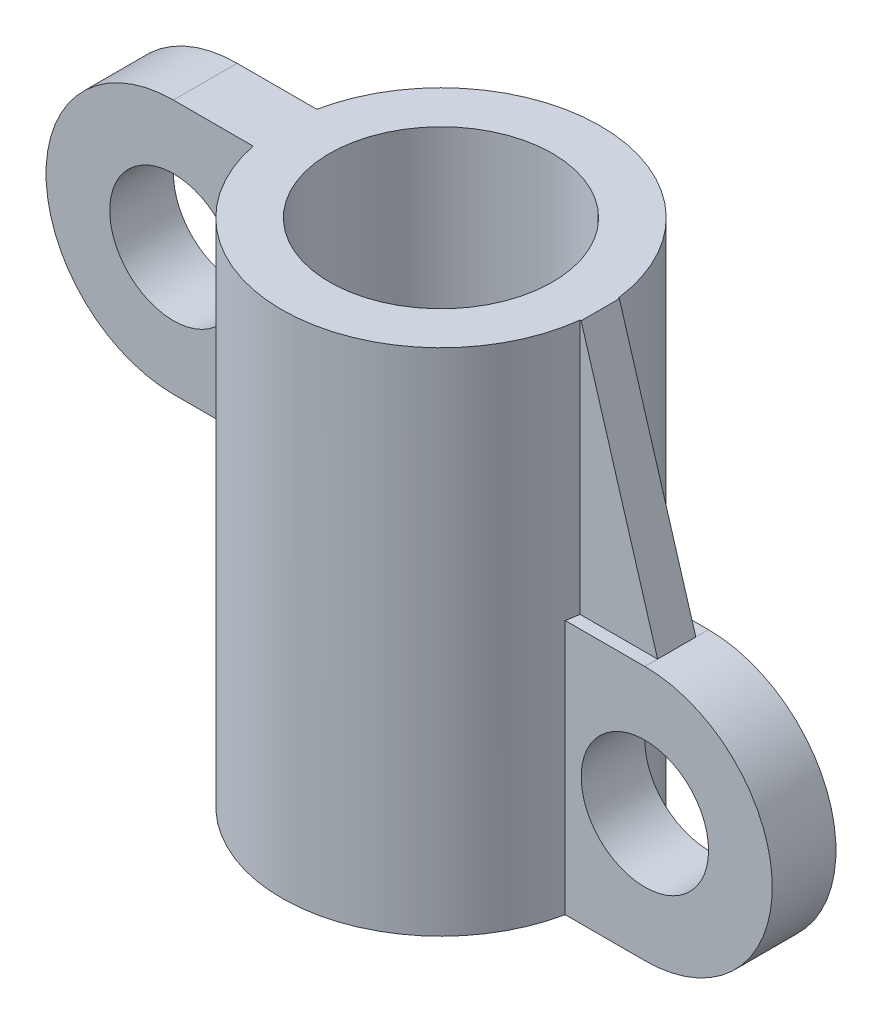
ISO-10303-21;
HEADER;
FILE_DESCRIPTION(('STEP AP214'),'2;1');
FILE_NAME('part.step','',(''),(''),'','','');
FILE_SCHEMA(('AUTOMOTIVE_DESIGN { 1 0 10303 214 1 1 1 1 }'));
ENDSEC;
DATA;
#1=APPLICATION_CONTEXT('core data for automotive mechanical design processes');
#2=APPLICATION_PROTOCOL_DEFINITION('international standard','automotive_design',2000,#1);
#3=PRODUCT_CONTEXT('',#1,'mechanical');
#4=PRODUCT('Part','Part','',(#3));
#5=PRODUCT_RELATED_PRODUCT_CATEGORY('part','',(#4));
#6=PRODUCT_DEFINITION_FORMATION('','',#4);
#7=PRODUCT_DEFINITION_CONTEXT('part definition',#1,'design');
#8=PRODUCT_DEFINITION('design','',#6,#7);
#9=PRODUCT_DEFINITION_SHAPE('','',#8);
#10=(LENGTH_UNIT() NAMED_UNIT(*) SI_UNIT(.MILLI.,.METRE.));
#11=(NAMED_UNIT(*) PLANE_ANGLE_UNIT() SI_UNIT($,.RADIAN.));
#12=(NAMED_UNIT(*) SI_UNIT($,.STERADIAN.) SOLID_ANGLE_UNIT());
#13=UNCERTAINTY_MEASURE_WITH_UNIT(LENGTH_MEASURE(1.E-05),#10,'distance_accuracy_value','');
#14=(GEOMETRIC_REPRESENTATION_CONTEXT(3) GLOBAL_UNCERTAINTY_ASSIGNED_CONTEXT((#13)) GLOBAL_UNIT_ASSIGNED_CONTEXT((#10,
#11,#12)) REPRESENTATION_CONTEXT('',''));
#15=CARTESIAN_POINT('',(0.,0.,0.));
#16=DIRECTION('',(0.,0.,1.));
#17=DIRECTION('',(1.,0.,0.));
#18=AXIS2_PLACEMENT_3D('',#15,#16,#17);
#19=CARTESIAN_POINT('',(37.,40.,-5.));
#20=DIRECTION('',(0.,1.,0.));
#21=DIRECTION('',(-1.,0.,0.));
#22=AXIS2_PLACEMENT_3D('',#19,#20,#21);
#23=PLANE('',#22);
#24=DIRECTION('',(0.,0.,1.));
#25=VECTOR('',#24,1.);
#26=CARTESIAN_POINT('',(37.,40.,-5.));
#27=LINE('',#26,#25);
#28=CARTESIAN_POINT('',(37.,40.,3.));
#29=VERTEX_POINT('',#28);
#30=CARTESIAN_POINT('',(37.,40.,5.));
#31=VERTEX_POINT('',#30);
#32=EDGE_CURVE('E222',#29,#31,#27,.T.);
#33=ORIENTED_EDGE('',*,*,#32,.F.);
#34=DIRECTION('',(1.,0.,0.));
#35=VECTOR('',#34,1.);
#36=CARTESIAN_POINT('',(37.,40.,3.));
#37=LINE('',#36,#35);
#38=CARTESIAN_POINT('',(24.8193472919817,40.,3.));
#39=VERTEX_POINT('',#38);
#40=EDGE_CURVE('E151',#39,#29,#37,.T.);
#41=ORIENTED_EDGE('',*,*,#40,.F.);
#42=CARTESIAN_POINT('',(0.,40.,0.));
#43=DIRECTION('',(0.,1.,0.));
#44=DIRECTION('',(-1.,0.,0.));
#45=AXIS2_PLACEMENT_3D('',#42,#43,#44);
#46=CIRCLE('',#45,25.);
#47=CARTESIAN_POINT('',(24.4948974278318,40.,5.));
#48=VERTEX_POINT('',#47);
#49=EDGE_CURVE('E11',#48,#39,#46,.T.);
#50=ORIENTED_EDGE('',*,*,#49,.F.);
#51=DIRECTION('',(-1.,0.,0.));
#52=VECTOR('',#51,1.);
#53=CARTESIAN_POINT('',(37.,40.,5.));
#54=LINE('',#53,#52);
#55=EDGE_CURVE('E69',#31,#48,#54,.T.);
#56=ORIENTED_EDGE('',*,*,#55,.F.);
#57=EDGE_LOOP('',(#33,#41,#50,#56));
#58=FACE_BOUND('',#57,.T.);
#59=ADVANCED_FACE('F45',(#58),#23,.T.);
#60=CARTESIAN_POINT('',(0.,80.,0.));
#61=DIRECTION('',(0.,-1.,0.));
#62=DIRECTION('',(0.,0.,-1.));
#63=AXIS2_PLACEMENT_3D('',#60,#61,#62);
#64=CYLINDRICAL_SURFACE('',#63,25.);
#65=CARTESIAN_POINT('',(0.,80.,0.));
#66=DIRECTION('',(0.,1.,0.));
#67=DIRECTION('',(0.,0.,1.));
#68=AXIS2_PLACEMENT_3D('',#65,#66,#67);
#69=CIRCLE('',#68,25.);
#70=CARTESIAN_POINT('',(24.8193472919817,80.,-3.));
#71=VERTEX_POINT('',#70);
#72=CARTESIAN_POINT('',(-24.4948974278318,80.,-5.));
#73=VERTEX_POINT('',#72);
#74=EDGE_CURVE('E280',#71,#73,#69,.T.);
#75=ORIENTED_EDGE('',*,*,#74,.F.);
#76=DIRECTION('',(0.,-1.,0.));
#77=VECTOR('',#76,1.);
#78=CARTESIAN_POINT('',(24.8193472919817,80.,-3.));
#79=LINE('',#78,#77);
#80=CARTESIAN_POINT('',(24.8193472919817,40.,-3.));
#81=VERTEX_POINT('',#80);
#82=EDGE_CURVE('E185',#71,#81,#79,.T.);
#83=ORIENTED_EDGE('',*,*,#82,.T.);
#84=CARTESIAN_POINT('',(24.4948974278318,40.,-5.));
#85=VERTEX_POINT('',#84);
#86=EDGE_CURVE('E54',#81,#85,#46,.T.);
#87=ORIENTED_EDGE('',*,*,#86,.T.);
#88=DIRECTION('',(0.,-1.,0.));
#89=VECTOR('',#88,1.);
#90=CARTESIAN_POINT('',(24.4948974278318,80.,-5.));
#91=LINE('',#90,#89);
#92=CARTESIAN_POINT('',(24.4948974278318,0.,-5.));
#93=VERTEX_POINT('',#92);
#94=EDGE_CURVE('E229',#93,#85,#91,.F.);
#95=ORIENTED_EDGE('',*,*,#94,.F.);
#96=CARTESIAN_POINT('',(0.,0.,0.));
#97=DIRECTION('',(0.,1.,0.));
#98=DIRECTION('',(0.,0.,1.));
#99=AXIS2_PLACEMENT_3D('',#96,#97,#98);
#100=CIRCLE('',#99,25.);
#101=CARTESIAN_POINT('',(24.4948974278318,0.,5.));
#102=VERTEX_POINT('',#101);
#103=EDGE_CURVE('E276',#93,#102,#100,.T.);
#104=ORIENTED_EDGE('',*,*,#103,.T.);
#105=DIRECTION('',(0.,-1.,0.));
#106=VECTOR('',#105,1.);
#107=CARTESIAN_POINT('',(24.4948974278318,80.,5.));
#108=LINE('',#107,#106);
#109=EDGE_CURVE('E221',#102,#48,#108,.F.);
#110=ORIENTED_EDGE('',*,*,#109,.T.);
#111=ORIENTED_EDGE('',*,*,#49,.T.);
#112=DIRECTION('',(0.,-1.,0.));
#113=VECTOR('',#112,1.);
#114=CARTESIAN_POINT('',(24.8193472919817,80.,3.));
#115=LINE('',#114,#113);
#116=CARTESIAN_POINT('',(24.8193472919817,80.,3.));
#117=VERTEX_POINT('',#116);
#118=EDGE_CURVE('E143',#117,#39,#115,.T.);
#119=ORIENTED_EDGE('',*,*,#118,.F.);
#120=CARTESIAN_POINT('',(-24.4948974278318,80.,5.));
#121=VERTEX_POINT('',#120);
#122=EDGE_CURVE('E160',#121,#117,#69,.T.);
#123=ORIENTED_EDGE('',*,*,#122,.F.);
#124=DIRECTION('',(0.,-1.,0.));
#125=VECTOR('',#124,1.);
#126=CARTESIAN_POINT('',(-24.4948974278318,80.,5.));
#127=LINE('',#126,#125);
#128=CARTESIAN_POINT('',(-24.4948974278318,40.,5.));
#129=VERTEX_POINT('',#128);
#130=EDGE_CURVE('E266',#121,#129,#127,.T.);
#131=ORIENTED_EDGE('',*,*,#130,.T.);
#132=CARTESIAN_POINT('',(0.,40.,0.));
#133=DIRECTION('',(0.,-1.,0.));
#134=DIRECTION('',(0.,0.,-1.));
#135=AXIS2_PLACEMENT_3D('',#132,#133,#134);
#136=CIRCLE('',#135,25.);
#137=CARTESIAN_POINT('',(-24.4948974278318,40.,-5.));
#138=VERTEX_POINT('',#137);
#139=EDGE_CURVE('E279',#129,#138,#136,.T.);
#140=ORIENTED_EDGE('',*,*,#139,.T.);
#141=DIRECTION('',(0.,-1.,0.));
#142=VECTOR('',#141,1.);
#143=CARTESIAN_POINT('',(-24.4948974278318,80.,-5.));
#144=LINE('',#143,#142);
#145=EDGE_CURVE('E273',#73,#138,#144,.T.);
#146=ORIENTED_EDGE('',*,*,#145,.F.);
#147=EDGE_LOOP('',(#75,#83,#87,#95,#104,#110,#111,#119,#123,#131,#140,#146));
#148=FACE_BOUND('',#147,.T.);
#149=ADVANCED_FACE('F47',(#148),#64,.T.);
#150=CARTESIAN_POINT('',(0.,80.,0.));
#151=DIRECTION('',(0.,1.,0.));
#152=DIRECTION('',(0.,0.,1.));
#153=AXIS2_PLACEMENT_3D('',#150,#151,#152);
#154=PLANE('',#153);
#155=CARTESIAN_POINT('',(0.,80.,0.));
#156=DIRECTION('',(0.,1.,0.));
#157=DIRECTION('',(0.,0.,1.));
#158=AXIS2_PLACEMENT_3D('',#155,#156,#157);
#159=CIRCLE('',#158,17.5);
#160=CARTESIAN_POINT('',(0.,80.,-17.5));
#161=VERTEX_POINT('',#160);
#162=EDGE_CURVE('E162',#161,#161,#159,.T.);
#163=ORIENTED_EDGE('',*,*,#162,.F.);
#164=EDGE_LOOP('',(#163));
#165=FACE_BOUND('',#164,.T.);
#166=ORIENTED_EDGE('',*,*,#122,.T.);
#167=DIRECTION('',(-1.,0.,0.));
#168=VECTOR('',#167,1.);
#169=CARTESIAN_POINT('',(25.,80.,3.));
#170=LINE('',#169,#168);
#171=CARTESIAN_POINT('',(25.,80.,3.));
#172=VERTEX_POINT('',#171);
#173=EDGE_CURVE('E148',#172,#117,#170,.T.);
#174=ORIENTED_EDGE('',*,*,#173,.F.);
#175=DIRECTION('',(0.,0.,1.));
#176=VECTOR('',#175,1.);
#177=CARTESIAN_POINT('',(25.,80.,-3.));
#178=LINE('',#177,#176);
#179=CARTESIAN_POINT('',(25.,80.,-3.));
#180=VERTEX_POINT('',#179);
#181=EDGE_CURVE('E134',#180,#172,#178,.T.);
#182=ORIENTED_EDGE('',*,*,#181,.F.);
#183=DIRECTION('',(-1.,0.,0.));
#184=VECTOR('',#183,1.);
#185=CARTESIAN_POINT('',(25.,80.,-3.));
#186=LINE('',#185,#184);
#187=EDGE_CURVE('E154',#180,#71,#186,.T.);
#188=ORIENTED_EDGE('',*,*,#187,.T.);
#189=ORIENTED_EDGE('',*,*,#74,.T.);
#190=DIRECTION('',(-1.,0.,0.));
#191=VECTOR('',#190,1.);
#192=CARTESIAN_POINT('',(0.,80.,-5.));
#193=LINE('',#192,#191);
#194=CARTESIAN_POINT('',(-37.,80.,-5.));
#195=VERTEX_POINT('',#194);
#196=EDGE_CURVE('E251',#73,#195,#193,.T.);
#197=ORIENTED_EDGE('',*,*,#196,.T.);
#198=DIRECTION('',(0.,0.,1.));
#199=VECTOR('',#198,1.);
#200=CARTESIAN_POINT('',(-37.,80.,-5.));
#201=LINE('',#200,#199);
#202=CARTESIAN_POINT('',(-37.,80.,5.));
#203=VERTEX_POINT('',#202);
#204=EDGE_CURVE('E262',#195,#203,#201,.T.);
#205=ORIENTED_EDGE('',*,*,#204,.T.);
#206=DIRECTION('',(-1.,0.,0.));
#207=VECTOR('',#206,1.);
#208=CARTESIAN_POINT('',(0.,80.,5.));
#209=LINE('',#208,#207);
#210=EDGE_CURVE('E237',#121,#203,#209,.T.);
#211=ORIENTED_EDGE('',*,*,#210,.F.);
#212=EDGE_LOOP('',(#166,#174,#182,#188,#189,#197,#205,#211));
#213=FACE_BOUND('',#212,.T.);
#214=ADVANCED_FACE('F157',(#165,#213),#154,.T.);
#215=CARTESIAN_POINT('',(0.,0.,0.));
#216=DIRECTION('',(0.,1.,0.));
#217=DIRECTION('',(0.,0.,1.));
#218=AXIS2_PLACEMENT_3D('',#215,#216,#217);
#219=PLANE('',#218);
#220=CARTESIAN_POINT('',(0.,0.,0.));
#221=DIRECTION('',(0.,1.,0.));
#222=DIRECTION('',(0.,0.,1.));
#223=AXIS2_PLACEMENT_3D('',#220,#221,#222);
#224=CIRCLE('',#223,17.5);
#225=CARTESIAN_POINT('',(0.,0.,-17.5));
#226=VERTEX_POINT('',#225);
#227=EDGE_CURVE('E168',#226,#226,#224,.T.);
#228=ORIENTED_EDGE('',*,*,#227,.T.);
#229=EDGE_LOOP('',(#228));
#230=FACE_BOUND('',#229,.T.);
#231=ORIENTED_EDGE('',*,*,#103,.F.);
#232=DIRECTION('',(1.,0.,0.));
#233=VECTOR('',#232,1.);
#234=CARTESIAN_POINT('',(0.,0.,-5.));
#235=LINE('',#234,#233);
#236=CARTESIAN_POINT('',(37.,0.,-5.));
#237=VERTEX_POINT('',#236);
#238=EDGE_CURVE('E205',#93,#237,#235,.T.);
#239=ORIENTED_EDGE('',*,*,#238,.T.);
#240=DIRECTION('',(0.,0.,1.));
#241=VECTOR('',#240,1.);
#242=CARTESIAN_POINT('',(37.,0.,-5.));
#243=LINE('',#242,#241);
#244=CARTESIAN_POINT('',(37.,0.,5.));
#245=VERTEX_POINT('',#244);
#246=EDGE_CURVE('E216',#237,#245,#243,.T.);
#247=ORIENTED_EDGE('',*,*,#246,.T.);
#248=DIRECTION('',(1.,0.,0.));
#249=VECTOR('',#248,1.);
#250=CARTESIAN_POINT('',(0.,0.,5.));
#251=LINE('',#250,#249);
#252=EDGE_CURVE('E193',#102,#245,#251,.T.);
#253=ORIENTED_EDGE('',*,*,#252,.F.);
#254=EDGE_LOOP('',(#231,#239,#247,#253));
#255=FACE_BOUND('',#254,.T.);
#256=ADVANCED_FACE('F305',(#230,#255),#219,.F.);
#257=CARTESIAN_POINT('',(-37.,60.,-5.));
#258=DIRECTION('',(0.,0.,1.));
#259=DIRECTION('',(1.,0.,0.));
#260=AXIS2_PLACEMENT_3D('',#257,#258,#259);
#261=PLANE('',#260);
#262=CARTESIAN_POINT('',(-37.,60.,-5.));
#263=DIRECTION('',(0.,0.,1.));
#264=DIRECTION('',(1.,0.,0.));
#265=AXIS2_PLACEMENT_3D('',#262,#263,#264);
#266=CIRCLE('',#265,10.);
#267=CARTESIAN_POINT('',(-27.,60.,-5.));
#268=VERTEX_POINT('',#267);
#269=EDGE_CURVE('E247',#268,#268,#266,.T.);
#270=ORIENTED_EDGE('',*,*,#269,.T.);
#271=EDGE_LOOP('',(#270));
#272=FACE_BOUND('',#271,.T.);
#273=ORIENTED_EDGE('',*,*,#196,.F.);
#274=ORIENTED_EDGE('',*,*,#145,.T.);
#275=DIRECTION('',(1.,0.,0.));
#276=VECTOR('',#275,1.);
#277=CARTESIAN_POINT('',(-37.,40.,-5.));
#278=LINE('',#277,#276);
#279=CARTESIAN_POINT('',(-37.,40.,-5.));
#280=VERTEX_POINT('',#279);
#281=EDGE_CURVE('E258',#280,#138,#278,.T.);
#282=ORIENTED_EDGE('',*,*,#281,.F.);
#283=CARTESIAN_POINT('',(-37.,60.,-5.));
#284=DIRECTION('',(0.,0.,1.));
#285=DIRECTION('',(1.,0.,0.));
#286=AXIS2_PLACEMENT_3D('',#283,#284,#285);
#287=CIRCLE('',#286,20.);
#288=EDGE_CURVE('E254',#195,#280,#287,.T.);
#289=ORIENTED_EDGE('',*,*,#288,.F.);
#290=EDGE_LOOP('',(#273,#274,#282,#289));
#291=FACE_BOUND('',#290,.T.);
#292=ADVANCED_FACE('F315',(#272,#291),#261,.F.);
#293=CARTESIAN_POINT('',(-37.,60.,5.));
#294=DIRECTION('',(0.,0.,1.));
#295=DIRECTION('',(1.,0.,0.));
#296=AXIS2_PLACEMENT_3D('',#293,#294,#295);
#297=PLANE('',#296);
#298=CARTESIAN_POINT('',(-37.,60.,5.));
#299=DIRECTION('',(0.,0.,1.));
#300=DIRECTION('',(1.,0.,0.));
#301=AXIS2_PLACEMENT_3D('',#298,#299,#300);
#302=CIRCLE('',#301,10.);
#303=CARTESIAN_POINT('',(-27.,60.,5.));
#304=VERTEX_POINT('',#303);
#305=EDGE_CURVE('E233',#304,#304,#302,.T.);
#306=ORIENTED_EDGE('',*,*,#305,.F.);
#307=EDGE_LOOP('',(#306));
#308=FACE_BOUND('',#307,.T.);
#309=ORIENTED_EDGE('',*,*,#130,.F.);
#310=ORIENTED_EDGE('',*,*,#210,.T.);
#311=CARTESIAN_POINT('',(-37.,60.,5.));
#312=DIRECTION('',(0.,0.,1.));
#313=DIRECTION('',(1.,0.,0.));
#314=AXIS2_PLACEMENT_3D('',#311,#312,#313);
#315=CIRCLE('',#314,20.);
#316=CARTESIAN_POINT('',(-37.,40.,5.));
#317=VERTEX_POINT('',#316);
#318=EDGE_CURVE('E240',#203,#317,#315,.T.);
#319=ORIENTED_EDGE('',*,*,#318,.T.);
#320=DIRECTION('',(1.,0.,0.));
#321=VECTOR('',#320,1.);
#322=CARTESIAN_POINT('',(-37.,40.,5.));
#323=LINE('',#322,#321);
#324=EDGE_CURVE('E244',#317,#129,#323,.T.);
#325=ORIENTED_EDGE('',*,*,#324,.T.);
#326=EDGE_LOOP('',(#309,#310,#319,#325));
#327=FACE_BOUND('',#326,.T.);
#328=ADVANCED_FACE('F325',(#308,#327),#297,.T.);
#329=CARTESIAN_POINT('',(-37.,40.,-5.));
#330=DIRECTION('',(0.,-1.,0.));
#331=DIRECTION('',(0.,0.,-1.));
#332=AXIS2_PLACEMENT_3D('',#329,#330,#331);
#333=PLANE('',#332);
#334=ORIENTED_EDGE('',*,*,#139,.F.);
#335=ORIENTED_EDGE('',*,*,#324,.F.);
#336=DIRECTION('',(0.,0.,1.));
#337=VECTOR('',#336,1.);
#338=CARTESIAN_POINT('',(-37.,40.,-5.));
#339=LINE('',#338,#337);
#340=EDGE_CURVE('E263',#280,#317,#339,.T.);
#341=ORIENTED_EDGE('',*,*,#340,.F.);
#342=ORIENTED_EDGE('',*,*,#281,.T.);
#343=EDGE_LOOP('',(#334,#335,#341,#342));
#344=FACE_BOUND('',#343,.T.);
#345=ADVANCED_FACE('F318',(#344),#333,.T.);
#346=CARTESIAN_POINT('',(-37.,60.,-5.));
#347=DIRECTION('',(0.,0.,1.));
#348=DIRECTION('',(1.,0.,0.));
#349=AXIS2_PLACEMENT_3D('',#346,#347,#348);
#350=CYLINDRICAL_SURFACE('',#349,20.);
#351=ORIENTED_EDGE('',*,*,#340,.T.);
#352=ORIENTED_EDGE('',*,*,#318,.F.);
#353=ORIENTED_EDGE('',*,*,#204,.F.);
#354=ORIENTED_EDGE('',*,*,#288,.T.);
#355=EDGE_LOOP('',(#351,#352,#353,#354));
#356=FACE_BOUND('',#355,.T.);
#357=ADVANCED_FACE('F323',(#356),#350,.T.);
#358=CARTESIAN_POINT('',(-37.,60.,-5.));
#359=DIRECTION('',(0.,0.,1.));
#360=DIRECTION('',(1.,0.,0.));
#361=AXIS2_PLACEMENT_3D('',#358,#359,#360);
#362=CYLINDRICAL_SURFACE('',#361,10.);
#363=ORIENTED_EDGE('',*,*,#269,.F.);
#364=EDGE_LOOP('',(#363));
#365=FACE_BOUND('',#364,.T.);
#366=ORIENTED_EDGE('',*,*,#305,.T.);
#367=EDGE_LOOP('',(#366));
#368=FACE_BOUND('',#367,.T.);
#369=ADVANCED_FACE('F357',(#365,#368),#362,.F.);
#370=CARTESIAN_POINT('',(37.,20.,-5.));
#371=DIRECTION('',(0.,0.,1.));
#372=DIRECTION('',(1.,0.,0.));
#373=AXIS2_PLACEMENT_3D('',#370,#371,#372);
#374=PLANE('',#373);
#375=CARTESIAN_POINT('',(37.,20.,-5.));
#376=DIRECTION('',(0.,0.,1.));
#377=DIRECTION('',(1.,0.,0.));
#378=AXIS2_PLACEMENT_3D('',#375,#376,#377);
#379=CIRCLE('',#378,10.);
#380=CARTESIAN_POINT('',(47.,20.,-5.));
#381=VERTEX_POINT('',#380);
#382=EDGE_CURVE('E201',#381,#381,#379,.T.);
#383=ORIENTED_EDGE('',*,*,#382,.T.);
#384=EDGE_LOOP('',(#383));
#385=FACE_BOUND('',#384,.T.);
#386=ORIENTED_EDGE('',*,*,#238,.F.);
#387=ORIENTED_EDGE('',*,*,#94,.T.);
#388=DIRECTION('',(-1.,0.,0.));
#389=VECTOR('',#388,1.);
#390=CARTESIAN_POINT('',(37.,40.,-5.));
#391=LINE('',#390,#389);
#392=CARTESIAN_POINT('',(37.,40.,-5.));
#393=VERTEX_POINT('',#392);
#394=EDGE_CURVE('E212',#393,#85,#391,.T.);
#395=ORIENTED_EDGE('',*,*,#394,.F.);
#396=CARTESIAN_POINT('',(37.,20.,-5.));
#397=DIRECTION('',(0.,0.,1.));
#398=DIRECTION('',(1.,0.,0.));
#399=AXIS2_PLACEMENT_3D('',#396,#397,#398);
#400=CIRCLE('',#399,20.);
#401=EDGE_CURVE('E208',#237,#393,#400,.T.);
#402=ORIENTED_EDGE('',*,*,#401,.F.);
#403=EDGE_LOOP('',(#386,#387,#395,#402));
#404=FACE_BOUND('',#403,.T.);
#405=ADVANCED_FACE('F296',(#385,#404),#374,.F.);
#406=CARTESIAN_POINT('',(37.,20.,5.));
#407=DIRECTION('',(0.,0.,1.));
#408=DIRECTION('',(1.,0.,0.));
#409=AXIS2_PLACEMENT_3D('',#406,#407,#408);
#410=PLANE('',#409);
#411=CARTESIAN_POINT('',(37.,20.,5.));
#412=DIRECTION('',(0.,0.,1.));
#413=DIRECTION('',(1.,0.,0.));
#414=AXIS2_PLACEMENT_3D('',#411,#412,#413);
#415=CIRCLE('',#414,10.);
#416=CARTESIAN_POINT('',(47.,20.,5.));
#417=VERTEX_POINT('',#416);
#418=EDGE_CURVE('E189',#417,#417,#415,.T.);
#419=ORIENTED_EDGE('',*,*,#418,.F.);
#420=EDGE_LOOP('',(#419));
#421=FACE_BOUND('',#420,.T.);
#422=ORIENTED_EDGE('',*,*,#109,.F.);
#423=ORIENTED_EDGE('',*,*,#252,.T.);
#424=CARTESIAN_POINT('',(37.,20.,5.));
#425=DIRECTION('',(0.,0.,1.));
#426=DIRECTION('',(1.,0.,0.));
#427=AXIS2_PLACEMENT_3D('',#424,#425,#426);
#428=CIRCLE('',#427,20.);
#429=EDGE_CURVE('E196',#245,#31,#428,.T.);
#430=ORIENTED_EDGE('',*,*,#429,.T.);
#431=ORIENTED_EDGE('',*,*,#55,.T.);
#432=EDGE_LOOP('',(#422,#423,#430,#431));
#433=FACE_BOUND('',#432,.T.);
#434=ADVANCED_FACE('F306',(#421,#433),#410,.T.);
#435=DIRECTION('',(1.,0.,0.));
#436=VECTOR('',#435,1.);
#437=CARTESIAN_POINT('',(37.,40.,-3.));
#438=LINE('',#437,#436);
#439=CARTESIAN_POINT('',(37.,40.,-3.));
#440=VERTEX_POINT('',#439);
#441=EDGE_CURVE('E174',#81,#440,#438,.T.);
#442=ORIENTED_EDGE('',*,*,#441,.T.);
#443=EDGE_CURVE('E217',#393,#440,#27,.T.);
#444=ORIENTED_EDGE('',*,*,#443,.F.);
#445=ORIENTED_EDGE('',*,*,#394,.T.);
#446=ORIENTED_EDGE('',*,*,#86,.F.);
#447=EDGE_LOOP('',(#442,#444,#445,#446));
#448=FACE_BOUND('',#447,.T.);
#449=ADVANCED_FACE('F298',(#448),#23,.T.);
#450=CARTESIAN_POINT('',(37.,20.,-5.));
#451=DIRECTION('',(0.,0.,1.));
#452=DIRECTION('',(1.,0.,0.));
#453=AXIS2_PLACEMENT_3D('',#450,#451,#452);
#454=CYLINDRICAL_SURFACE('',#453,20.);
#455=ORIENTED_EDGE('',*,*,#443,.T.);
#456=DIRECTION('',(0.,0.,1.));
#457=VECTOR('',#456,1.);
#458=CARTESIAN_POINT('',(37.,40.,-3.));
#459=LINE('',#458,#457);
#460=EDGE_CURVE('E144',#440,#29,#459,.T.);
#461=ORIENTED_EDGE('',*,*,#460,.T.);
#462=ORIENTED_EDGE('',*,*,#32,.T.);
#463=ORIENTED_EDGE('',*,*,#429,.F.);
#464=ORIENTED_EDGE('',*,*,#246,.F.);
#465=ORIENTED_EDGE('',*,*,#401,.T.);
#466=EDGE_LOOP('',(#455,#461,#462,#463,#464,#465));
#467=FACE_BOUND('',#466,.T.);
#468=ADVANCED_FACE('F301',(#467),#454,.T.);
#469=CARTESIAN_POINT('',(37.,20.,-5.));
#470=DIRECTION('',(0.,0.,1.));
#471=DIRECTION('',(1.,0.,0.));
#472=AXIS2_PLACEMENT_3D('',#469,#470,#471);
#473=CYLINDRICAL_SURFACE('',#472,10.);
#474=ORIENTED_EDGE('',*,*,#382,.F.);
#475=EDGE_LOOP('',(#474));
#476=FACE_BOUND('',#475,.T.);
#477=ORIENTED_EDGE('',*,*,#418,.T.);
#478=EDGE_LOOP('',(#477));
#479=FACE_BOUND('',#478,.T.);
#480=ADVANCED_FACE('F350',(#476,#479),#473,.F.);
#481=CARTESIAN_POINT('',(0.,0.,-3.));
#482=DIRECTION('',(0.,0.,-1.));
#483=DIRECTION('',(-1.,0.,0.));
#484=AXIS2_PLACEMENT_3D('',#481,#482,#483);
#485=PLANE('',#484);
#486=ORIENTED_EDGE('',*,*,#82,.F.);
#487=ORIENTED_EDGE('',*,*,#187,.F.);
#488=DIRECTION('',(-0.287347885566345,0.957826285221151,0.));
#489=VECTOR('',#488,1.);
#490=CARTESIAN_POINT('',(25.,80.,-3.));
#491=LINE('',#490,#489);
#492=EDGE_CURVE('E137',#440,#180,#491,.T.);
#493=ORIENTED_EDGE('',*,*,#492,.F.);
#494=ORIENTED_EDGE('',*,*,#441,.F.);
#495=EDGE_LOOP('',(#486,#487,#493,#494));
#496=FACE_BOUND('',#495,.T.);
#497=ADVANCED_FACE('F310',(#496),#485,.T.);
#498=CARTESIAN_POINT('',(0.,0.,3.));
#499=DIRECTION('',(0.,0.,-1.));
#500=DIRECTION('',(-1.,0.,0.));
#501=AXIS2_PLACEMENT_3D('',#498,#499,#500);
#502=PLANE('',#501);
#503=ORIENTED_EDGE('',*,*,#173,.T.);
#504=ORIENTED_EDGE('',*,*,#118,.T.);
#505=ORIENTED_EDGE('',*,*,#40,.T.);
#506=DIRECTION('',(-0.287347885566345,0.957826285221151,0.));
#507=VECTOR('',#506,1.);
#508=CARTESIAN_POINT('',(25.,80.,3.));
#509=LINE('',#508,#507);
#510=EDGE_CURVE('E61',#29,#172,#509,.T.);
#511=ORIENTED_EDGE('',*,*,#510,.T.);
#512=EDGE_LOOP('',(#503,#504,#505,#511));
#513=FACE_BOUND('',#512,.T.);
#514=ADVANCED_FACE('F147',(#513),#502,.F.);
#515=CARTESIAN_POINT('',(25.,80.,-3.));
#516=DIRECTION('',(0.957826285221152,0.287347885566345,0.));
#517=DIRECTION('',(-0.287347885566345,0.957826285221152,0.));
#518=AXIS2_PLACEMENT_3D('',#515,#516,#517);
#519=PLANE('',#518);
#520=ORIENTED_EDGE('',*,*,#181,.T.);
#521=ORIENTED_EDGE('',*,*,#510,.F.);
#522=ORIENTED_EDGE('',*,*,#460,.F.);
#523=ORIENTED_EDGE('',*,*,#492,.T.);
#524=EDGE_LOOP('',(#520,#521,#522,#523));
#525=FACE_BOUND('',#524,.T.);
#526=ADVANCED_FACE('F135',(#525),#519,.T.);
#527=CARTESIAN_POINT('',(0.,80.,0.));
#528=DIRECTION('',(0.,-1.,0.));
#529=DIRECTION('',(0.,0.,-1.));
#530=AXIS2_PLACEMENT_3D('',#527,#528,#529);
#531=CYLINDRICAL_SURFACE('',#530,17.5);
#532=CARTESIAN_POINT('',(0.,80.,-17.5));
#533=CARTESIAN_POINT('',(0.,79.1666666666667,-17.5));
#534=CARTESIAN_POINT('',(0.,78.3333333333334,-17.5));
#535=CARTESIAN_POINT('',(0.,76.6666666666667,-17.5));
#536=CARTESIAN_POINT('',(0.,75.8333333333334,-17.5));
#537=CARTESIAN_POINT('',(0.,74.1666666666667,-17.5));
#538=CARTESIAN_POINT('',(0.,73.3333333333334,-17.5));
#539=CARTESIAN_POINT('',(0.,71.6666666666667,-17.5));
#540=CARTESIAN_POINT('',(0.,70.8333333333334,-17.5));
#541=CARTESIAN_POINT('',(0.,69.1666666666667,-17.5));
#542=CARTESIAN_POINT('',(0.,68.3333333333334,-17.5));
#543=CARTESIAN_POINT('',(0.,66.6666666666667,-17.5));
#544=CARTESIAN_POINT('',(0.,65.8333333333334,-17.5));
#545=CARTESIAN_POINT('',(0.,64.1666666666667,-17.5));
#546=CARTESIAN_POINT('',(0.,63.3333333333333,-17.5));
#547=CARTESIAN_POINT('',(0.,61.6666666666667,-17.5));
#548=CARTESIAN_POINT('',(0.,60.8333333333333,-17.5));
#549=CARTESIAN_POINT('',(0.,59.1666666666667,-17.5));
#550=CARTESIAN_POINT('',(0.,58.3333333333333,-17.5));
#551=CARTESIAN_POINT('',(0.,56.6666666666667,-17.5));
#552=CARTESIAN_POINT('',(0.,55.8333333333333,-17.5));
#553=CARTESIAN_POINT('',(0.,54.1666666666667,-17.5));
#554=CARTESIAN_POINT('',(0.,53.3333333333333,-17.5));
#555=CARTESIAN_POINT('',(0.,51.6666666666667,-17.5));
#556=CARTESIAN_POINT('',(0.,50.8333333333333,-17.5));
#557=CARTESIAN_POINT('',(0.,49.1666666666667,-17.5));
#558=CARTESIAN_POINT('',(0.,48.3333333333333,-17.5));
#559=CARTESIAN_POINT('',(0.,46.6666666666667,-17.5));
#560=CARTESIAN_POINT('',(0.,45.8333333333333,-17.5));
#561=CARTESIAN_POINT('',(0.,44.1666666666667,-17.5));
#562=CARTESIAN_POINT('',(0.,43.3333333333333,-17.5));
#563=CARTESIAN_POINT('',(0.,41.6666666666667,-17.5));
#564=CARTESIAN_POINT('',(0.,40.8333333333333,-17.5));
#565=CARTESIAN_POINT('',(0.,39.1666666666667,-17.5));
#566=CARTESIAN_POINT('',(0.,38.3333333333333,-17.5));
#567=CARTESIAN_POINT('',(0.,36.6666666666667,-17.5));
#568=CARTESIAN_POINT('',(0.,35.8333333333333,-17.5));
#569=CARTESIAN_POINT('',(0.,34.1666666666667,-17.5));
#570=CARTESIAN_POINT('',(0.,33.3333333333333,-17.5));
#571=CARTESIAN_POINT('',(0.,31.6666666666667,-17.5));
#572=CARTESIAN_POINT('',(0.,30.8333333333333,-17.5));
#573=CARTESIAN_POINT('',(0.,29.1666666666667,-17.5));
#574=CARTESIAN_POINT('',(0.,28.3333333333333,-17.5));
#575=CARTESIAN_POINT('',(0.,26.6666666666667,-17.5));
#576=CARTESIAN_POINT('',(0.,25.8333333333333,-17.5));
#577=CARTESIAN_POINT('',(0.,24.1666666666667,-17.5));
#578=CARTESIAN_POINT('',(0.,23.3333333333333,-17.5));
#579=CARTESIAN_POINT('',(0.,21.6666666666667,-17.5));
#580=CARTESIAN_POINT('',(0.,20.8333333333333,-17.5));
#581=CARTESIAN_POINT('',(0.,19.1666666666667,-17.5));
#582=CARTESIAN_POINT('',(0.,18.3333333333333,-17.5));
#583=CARTESIAN_POINT('',(0.,16.6666666666667,-17.5));
#584=CARTESIAN_POINT('',(0.,15.8333333333333,-17.5));
#585=CARTESIAN_POINT('',(0.,14.1666666666667,-17.5));
#586=CARTESIAN_POINT('',(0.,13.3333333333333,-17.5));
#587=CARTESIAN_POINT('',(0.,11.6666666666667,-17.5));
#588=CARTESIAN_POINT('',(0.,10.8333333333333,-17.5));
#589=CARTESIAN_POINT('',(0.,9.16666666666667,-17.5));
#590=CARTESIAN_POINT('',(0.,8.33333333333334,-17.5));
#591=CARTESIAN_POINT('',(0.,6.66666666666667,-17.5));
#592=CARTESIAN_POINT('',(0.,5.83333333333334,-17.5));
#593=CARTESIAN_POINT('',(0.,4.16666666666667,-17.5));
#594=CARTESIAN_POINT('',(0.,3.33333333333334,-17.5));
#595=CARTESIAN_POINT('',(0.,1.66666666666667,-17.5));
#596=CARTESIAN_POINT('',(0.,0.833333333333335,-17.5));
#597=CARTESIAN_POINT('',(0.,0.,-17.5));
#598=B_SPLINE_CURVE_WITH_KNOTS('',3,(#532,#533,#534,#535,#536,#537,#538,#539,#540,#541,#542,
#543,#544,#545,#546,#547,#548,#549,#550,#551,#552,#553,#554,#555,#556,#557,#558,#559,#560,#561,
#562,#563,#564,#565,#566,#567,#568,#569,#570,#571,#572,#573,#574,#575,#576,#577,#578,#579,#580,
#581,#582,#583,#584,#585,#586,#587,#588,#589,#590,#591,#592,#593,#594,#595,#596,#597),
.UNSPECIFIED.,.F.,.F.,(4,2,2,2,2,2,2,2,2,2,2,2,2,2,2,2,2,2,2,2,2,2,2,2,2,2,2,2,2,2,2,2,4),(0.,
2.5,5.,7.50000000000001,10.,12.5,15.,17.5,20.,22.5,25.,27.5,30.,32.5,35.,37.5,40.,42.5,45.,47.5,
50.,52.5,55.,57.5,60.,62.5,65.,67.5,70.,72.5,75.,77.5,80.),.UNSPECIFIED.);
#599=EDGE_CURVE('BSEAM374',#161,#226,#598,.T.);
#600=ORIENTED_EDGE('',*,*,#162,.T.);
#601=ORIENTED_EDGE('',*,*,#227,.F.);
#602=ORIENTED_EDGE('',*,*,#599,.T.);
#603=ORIENTED_EDGE('',*,*,#599,.F.);
#604=EDGE_LOOP('',(#600,#602,#601,#603));
#605=FACE_BOUND('',#604,.T.);
#606=ADVANCED_FACE('F374',(#605),#531,.F.);
#607=CLOSED_SHELL('',(#59,#149,#214,#256,#292,#328,#345,#357,#369,#405,#434,#449,#468,#480,#497,
#514,#526,#606));
#608=MANIFOLD_SOLID_BREP('B2',#607);
#609=ADVANCED_BREP_SHAPE_REPRESENTATION('',(#18,#608),#14);
#610=SHAPE_DEFINITION_REPRESENTATION(#9,#609);
ENDSEC;
END-ISO-10303-21;
